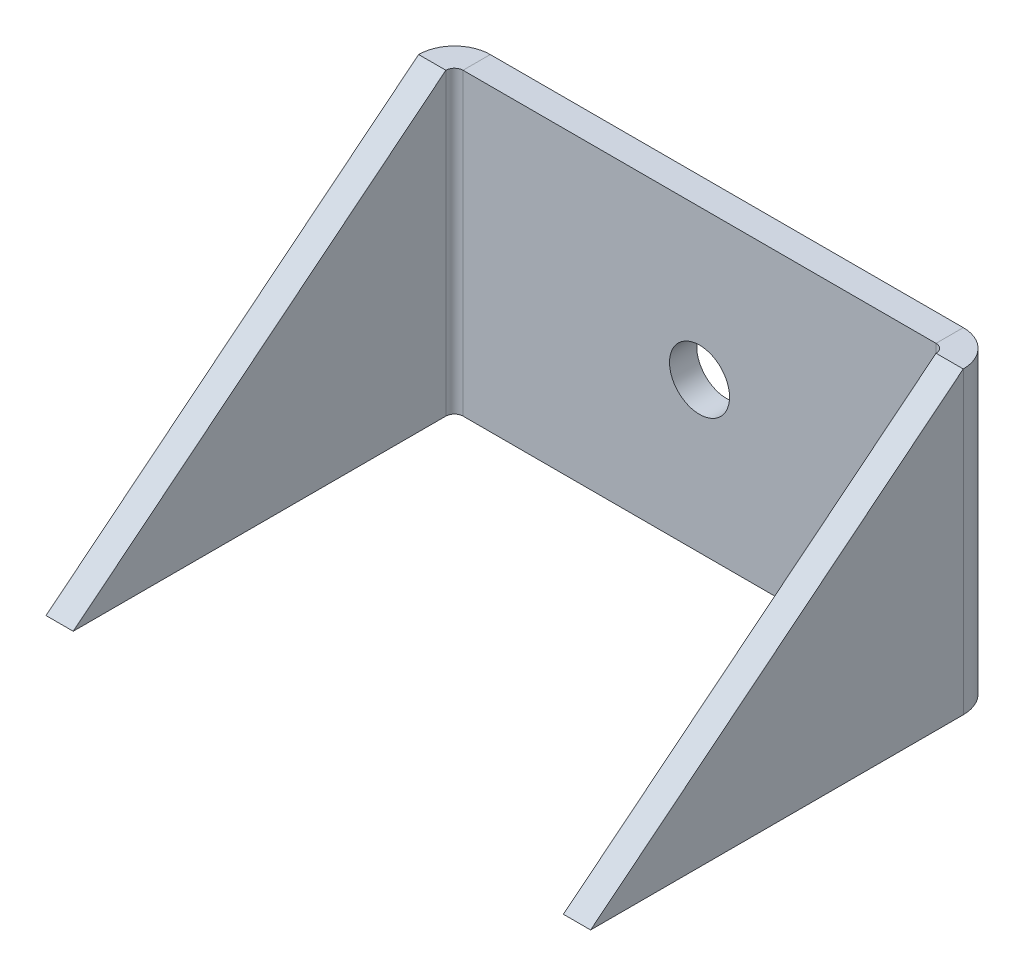
ISO-10303-21;
HEADER;
FILE_DESCRIPTION(('STEP AP214'),'2;1');
FILE_NAME('part.step','',(''),(''),'','','');
FILE_SCHEMA(('AUTOMOTIVE_DESIGN { 1 0 10303 214 1 1 1 1 }'));
ENDSEC;
DATA;
#1=APPLICATION_CONTEXT('core data for automotive mechanical design processes');
#2=APPLICATION_PROTOCOL_DEFINITION('international standard','automotive_design',2000,#1);
#3=PRODUCT_CONTEXT('',#1,'mechanical');
#4=PRODUCT('Part','Part','',(#3));
#5=PRODUCT_RELATED_PRODUCT_CATEGORY('part','',(#4));
#6=PRODUCT_DEFINITION_FORMATION('','',#4);
#7=PRODUCT_DEFINITION_CONTEXT('part definition',#1,'design');
#8=PRODUCT_DEFINITION('design','',#6,#7);
#9=PRODUCT_DEFINITION_SHAPE('','',#8);
#10=(LENGTH_UNIT() NAMED_UNIT(*) SI_UNIT(.MILLI.,.METRE.));
#11=(NAMED_UNIT(*) PLANE_ANGLE_UNIT() SI_UNIT($,.RADIAN.));
#12=(NAMED_UNIT(*) SI_UNIT($,.STERADIAN.) SOLID_ANGLE_UNIT());
#13=UNCERTAINTY_MEASURE_WITH_UNIT(LENGTH_MEASURE(1.E-05),#10,'distance_accuracy_value','');
#14=(GEOMETRIC_REPRESENTATION_CONTEXT(3) GLOBAL_UNCERTAINTY_ASSIGNED_CONTEXT((#13)) GLOBAL_UNIT_ASSIGNED_CONTEXT((#10,
#11,#12)) REPRESENTATION_CONTEXT('',''));
#15=CARTESIAN_POINT('',(0.,0.,0.));
#16=DIRECTION('',(0.,0.,1.));
#17=DIRECTION('',(1.,0.,0.));
#18=AXIS2_PLACEMENT_3D('',#15,#16,#17);
#19=CARTESIAN_POINT('',(-31.75,0.,-1.11451597218056E-13));
#20=DIRECTION('',(1.,0.,0.));
#21=DIRECTION('',(0.,0.,1.));
#22=AXIS2_PLACEMENT_3D('',#19,#20,#21);
#23=PLANE('',#22);
#24=DIRECTION('',(0.,0.626498155753381,-0.77942290243334));
#25=VECTOR('',#24,1.);
#26=CARTESIAN_POINT('',(-31.75,17.4625,4.17499999999998));
#27=LINE('',#26,#25);
#28=CARTESIAN_POINT('',(-31.7500000000002,-17.4625,47.625));
#29=VERTEX_POINT('',#28);
#30=CARTESIAN_POINT('',(-31.75,17.4625,4.17499999999998));
#31=VERTEX_POINT('',#30);
#32=EDGE_CURVE('E132',#29,#31,#27,.T.);
#33=ORIENTED_EDGE('',*,*,#32,.T.);
#34=DIRECTION('',(0.,1.,0.));
#35=VECTOR('',#34,1.);
#36=CARTESIAN_POINT('',(-31.75,0.,4.17499999999998));
#37=LINE('',#36,#35);
#38=CARTESIAN_POINT('',(-31.75,-17.4625,4.17499999999999));
#39=VERTEX_POINT('',#38);
#40=EDGE_CURVE('E155',#39,#31,#37,.T.);
#41=ORIENTED_EDGE('',*,*,#40,.F.);
#42=DIRECTION('',(0.,0.,-1.));
#43=VECTOR('',#42,1.);
#44=CARTESIAN_POINT('',(-31.75,-17.4625,3.17499999999999));
#45=LINE('',#44,#43);
#46=EDGE_CURVE('E161',#29,#39,#45,.T.);
#47=ORIENTED_EDGE('',*,*,#46,.F.);
#48=EDGE_LOOP('',(#33,#41,#47));
#49=FACE_BOUND('',#48,.T.);
#50=ADVANCED_FACE('F42',(#49),#23,.F.);
#51=CARTESIAN_POINT('',(-28.575,0.,-1.00366143967229E-13));
#52=DIRECTION('',(1.,0.,0.));
#53=DIRECTION('',(0.,0.,1.));
#54=AXIS2_PLACEMENT_3D('',#51,#52,#53);
#55=PLANE('',#54);
#56=DIRECTION('',(0.,-1.,0.));
#57=VECTOR('',#56,1.);
#58=CARTESIAN_POINT('',(-28.575,17.4625,4.17499999999999));
#59=LINE('',#58,#57);
#60=CARTESIAN_POINT('',(-28.575,17.4625,4.17499999999999));
#61=VERTEX_POINT('',#60);
#62=CARTESIAN_POINT('',(-28.575,-17.4625,4.175));
#63=VERTEX_POINT('',#62);
#64=EDGE_CURVE('E142',#61,#63,#59,.T.);
#65=ORIENTED_EDGE('',*,*,#64,.F.);
#66=DIRECTION('',(0.,0.626498155753381,-0.77942290243334));
#67=VECTOR('',#66,1.);
#68=CARTESIAN_POINT('',(-28.575,17.4625,4.17499999999999));
#69=LINE('',#68,#67);
#70=CARTESIAN_POINT('',(-28.5750000000001,-17.4625,47.625));
#71=VERTEX_POINT('',#70);
#72=EDGE_CURVE('E121',#71,#61,#69,.T.);
#73=ORIENTED_EDGE('',*,*,#72,.F.);
#74=DIRECTION('',(0.,0.,-1.));
#75=VECTOR('',#74,1.);
#76=CARTESIAN_POINT('',(-28.575,-17.4625,3.175));
#77=LINE('',#76,#75);
#78=EDGE_CURVE('E151',#71,#63,#77,.T.);
#79=ORIENTED_EDGE('',*,*,#78,.T.);
#80=EDGE_LOOP('',(#65,#73,#79));
#81=FACE_BOUND('',#80,.T.);
#82=ADVANCED_FACE('F150',(#81),#55,.T.);
#83=CARTESIAN_POINT('',(-28.575,17.4625,3.175));
#84=DIRECTION('',(0.,-1.,0.));
#85=DIRECTION('',(0.,0.,-1.));
#86=AXIS2_PLACEMENT_3D('',#83,#84,#85);
#87=PLANE('',#86);
#88=DIRECTION('',(0.,0.,-1.));
#89=VECTOR('',#88,1.);
#90=CARTESIAN_POINT('',(-27.575,17.4625,3.175));
#91=LINE('',#90,#89);
#92=CARTESIAN_POINT('',(-27.575,17.4625,3.175));
#93=VERTEX_POINT('',#92);
#94=CARTESIAN_POINT('',(-27.575,17.4625,0.));
#95=VERTEX_POINT('',#94);
#96=EDGE_CURVE('E59',#93,#95,#91,.T.);
#97=ORIENTED_EDGE('',*,*,#96,.F.);
#98=DIRECTION('',(-1.,0.,0.));
#99=VECTOR('',#98,1.);
#100=CARTESIAN_POINT('',(-28.575,17.4625,3.175));
#101=LINE('',#100,#99);
#102=CARTESIAN_POINT('',(27.575,17.4625,3.175));
#103=VERTEX_POINT('',#102);
#104=EDGE_CURVE('E51',#103,#93,#101,.T.);
#105=ORIENTED_EDGE('',*,*,#104,.F.);
#106=DIRECTION('',(0.,0.,-1.));
#107=VECTOR('',#106,1.);
#108=CARTESIAN_POINT('',(27.575,17.4625,3.17499999999999));
#109=LINE('',#108,#107);
#110=CARTESIAN_POINT('',(27.575,17.4625,0.));
#111=VERTEX_POINT('',#110);
#112=EDGE_CURVE('E210',#103,#111,#109,.T.);
#113=ORIENTED_EDGE('',*,*,#112,.T.);
#114=DIRECTION('',(-1.,0.,0.));
#115=VECTOR('',#114,1.);
#116=CARTESIAN_POINT('',(-28.575,17.4625,0.));
#117=LINE('',#116,#115);
#118=EDGE_CURVE('E224',#111,#95,#117,.T.);
#119=ORIENTED_EDGE('',*,*,#118,.T.);
#120=EDGE_LOOP('',(#97,#105,#113,#119));
#121=FACE_BOUND('',#120,.T.);
#122=ADVANCED_FACE('F44',(#121),#87,.F.);
#123=CARTESIAN_POINT('',(-28.575,-17.4625,3.175));
#124=DIRECTION('',(0.,1.,0.));
#125=DIRECTION('',(0.,0.,1.));
#126=AXIS2_PLACEMENT_3D('',#123,#124,#125);
#127=PLANE('',#126);
#128=DIRECTION('',(0.,0.,-1.));
#129=VECTOR('',#128,1.);
#130=CARTESIAN_POINT('',(-27.575,-17.4625,3.175));
#131=LINE('',#130,#129);
#132=CARTESIAN_POINT('',(-27.575,-17.4625,3.175));
#133=VERTEX_POINT('',#132);
#134=CARTESIAN_POINT('',(-27.575,-17.4625,0.));
#135=VERTEX_POINT('',#134);
#136=EDGE_CURVE('E170',#133,#135,#131,.T.);
#137=ORIENTED_EDGE('',*,*,#136,.T.);
#138=DIRECTION('',(1.,0.,0.));
#139=VECTOR('',#138,1.);
#140=CARTESIAN_POINT('',(-28.575,-17.4625,0.));
#141=LINE('',#140,#139);
#142=CARTESIAN_POINT('',(27.575,-17.4625,0.));
#143=VERTEX_POINT('',#142);
#144=EDGE_CURVE('E46',#135,#143,#141,.T.);
#145=ORIENTED_EDGE('',*,*,#144,.T.);
#146=DIRECTION('',(0.,0.,-1.));
#147=VECTOR('',#146,1.);
#148=CARTESIAN_POINT('',(27.575,-17.4625,3.17499999999999));
#149=LINE('',#148,#147);
#150=CARTESIAN_POINT('',(27.575,-17.4625,3.175));
#151=VERTEX_POINT('',#150);
#152=EDGE_CURVE('E221',#151,#143,#149,.T.);
#153=ORIENTED_EDGE('',*,*,#152,.F.);
#154=DIRECTION('',(1.,0.,0.));
#155=VECTOR('',#154,1.);
#156=CARTESIAN_POINT('',(-28.575,-17.4625,3.175));
#157=LINE('',#156,#155);
#158=EDGE_CURVE('E11',#133,#151,#157,.T.);
#159=ORIENTED_EDGE('',*,*,#158,.F.);
#160=EDGE_LOOP('',(#137,#145,#153,#159));
#161=FACE_BOUND('',#160,.T.);
#162=ADVANCED_FACE('F230',(#161),#127,.F.);
#163=CARTESIAN_POINT('',(0.,0.,3.175));
#164=DIRECTION('',(0.,0.,1.));
#165=DIRECTION('',(1.,0.,0.));
#166=AXIS2_PLACEMENT_3D('',#163,#164,#165);
#167=PLANE('',#166);
#168=CARTESIAN_POINT('',(0.,0.,3.175));
#169=DIRECTION('',(0.,0.,1.));
#170=DIRECTION('',(1.,0.,0.));
#171=AXIS2_PLACEMENT_3D('',#168,#169,#170);
#172=CIRCLE('',#171,3.5);
#173=CARTESIAN_POINT('',(3.5,0.,3.175));
#174=VERTEX_POINT('',#173);
#175=EDGE_CURVE('E300',#174,#174,#172,.T.);
#176=ORIENTED_EDGE('',*,*,#175,.F.);
#177=EDGE_LOOP('',(#176));
#178=FACE_BOUND('',#177,.T.);
#179=ORIENTED_EDGE('',*,*,#104,.T.);
#180=DIRECTION('',(0.,-1.,0.));
#181=VECTOR('',#180,1.);
#182=CARTESIAN_POINT('',(-27.575,-17.4625,3.175));
#183=LINE('',#182,#181);
#184=EDGE_CURVE('E65',#133,#93,#183,.F.);
#185=ORIENTED_EDGE('',*,*,#184,.F.);
#186=ORIENTED_EDGE('',*,*,#158,.T.);
#187=DIRECTION('',(0.,1.,0.));
#188=VECTOR('',#187,1.);
#189=CARTESIAN_POINT('',(27.575,17.4625,3.17499999999999));
#190=LINE('',#189,#188);
#191=EDGE_CURVE('E216',#103,#151,#190,.F.);
#192=ORIENTED_EDGE('',*,*,#191,.F.);
#193=EDGE_LOOP('',(#179,#185,#186,#192));
#194=FACE_BOUND('',#193,.T.);
#195=ADVANCED_FACE('F262',(#178,#194),#167,.T.);
#196=CARTESIAN_POINT('',(0.,0.,0.));
#197=DIRECTION('',(0.,0.,1.));
#198=DIRECTION('',(1.,0.,0.));
#199=AXIS2_PLACEMENT_3D('',#196,#197,#198);
#200=PLANE('',#199);
#201=CARTESIAN_POINT('',(0.,0.,0.));
#202=DIRECTION('',(0.,0.,1.));
#203=DIRECTION('',(1.,0.,0.));
#204=AXIS2_PLACEMENT_3D('',#201,#202,#203);
#205=CIRCLE('',#204,3.5);
#206=CARTESIAN_POINT('',(3.5,0.,0.));
#207=VERTEX_POINT('',#206);
#208=EDGE_CURVE('E297',#207,#207,#205,.T.);
#209=ORIENTED_EDGE('',*,*,#208,.T.);
#210=EDGE_LOOP('',(#209));
#211=FACE_BOUND('',#210,.T.);
#212=DIRECTION('',(0.,-1.,0.));
#213=VECTOR('',#212,1.);
#214=CARTESIAN_POINT('',(-27.575,-17.4625,0.));
#215=LINE('',#214,#213);
#216=EDGE_CURVE('E167',#135,#95,#215,.F.);
#217=ORIENTED_EDGE('',*,*,#216,.T.);
#218=ORIENTED_EDGE('',*,*,#118,.F.);
#219=DIRECTION('',(0.,1.,0.));
#220=VECTOR('',#219,1.);
#221=CARTESIAN_POINT('',(27.575,17.4625,0.));
#222=LINE('',#221,#220);
#223=EDGE_CURVE('E203',#111,#143,#222,.F.);
#224=ORIENTED_EDGE('',*,*,#223,.T.);
#225=ORIENTED_EDGE('',*,*,#144,.F.);
#226=EDGE_LOOP('',(#217,#218,#224,#225));
#227=FACE_BOUND('',#226,.T.);
#228=ADVANCED_FACE('F235',(#211,#227),#200,.F.);
#229=CARTESIAN_POINT('',(27.575,-17.4625,4.175));
#230=DIRECTION('',(0.,-1.,0.));
#231=DIRECTION('',(0.,0.,-1.));
#232=AXIS2_PLACEMENT_3D('',#229,#230,#231);
#233=PLANE('',#232);
#234=DIRECTION('',(1.,0.,0.));
#235=VECTOR('',#234,1.);
#236=CARTESIAN_POINT('',(28.575,-17.4625,4.17499999999999));
#237=LINE('',#236,#235);
#238=CARTESIAN_POINT('',(28.575,-17.4625,4.17499999999999));
#239=VERTEX_POINT('',#238);
#240=CARTESIAN_POINT('',(31.75,-17.4625,4.17499999999998));
#241=VERTEX_POINT('',#240);
#242=EDGE_CURVE('E181',#239,#241,#237,.T.);
#243=ORIENTED_EDGE('',*,*,#242,.F.);
#244=CARTESIAN_POINT('',(27.575,-17.4625,4.175));
#245=DIRECTION('',(0.,1.,0.));
#246=DIRECTION('',(0.,0.,1.));
#247=AXIS2_PLACEMENT_3D('',#244,#245,#246);
#248=CIRCLE('',#247,1.);
#249=EDGE_CURVE('E213',#151,#239,#248,.F.);
#250=ORIENTED_EDGE('',*,*,#249,.F.);
#251=ORIENTED_EDGE('',*,*,#152,.T.);
#252=CARTESIAN_POINT('',(27.575,-17.4625,4.175));
#253=DIRECTION('',(0.,1.,0.));
#254=DIRECTION('',(0.,0.,1.));
#255=AXIS2_PLACEMENT_3D('',#252,#253,#254);
#256=CIRCLE('',#255,4.175);
#257=EDGE_CURVE('E206',#143,#241,#256,.F.);
#258=ORIENTED_EDGE('',*,*,#257,.T.);
#259=EDGE_LOOP('',(#243,#250,#251,#258));
#260=FACE_BOUND('',#259,.T.);
#261=ADVANCED_FACE('F241',(#260),#233,.T.);
#262=CARTESIAN_POINT('',(27.575,17.4625,4.175));
#263=DIRECTION('',(0.,-1.,0.));
#264=DIRECTION('',(0.,0.,-1.));
#265=AXIS2_PLACEMENT_3D('',#262,#263,#264);
#266=PLANE('',#265);
#267=CARTESIAN_POINT('',(27.575,17.4625,4.175));
#268=DIRECTION('',(0.,1.,0.));
#269=DIRECTION('',(0.,0.,1.));
#270=AXIS2_PLACEMENT_3D('',#267,#268,#269);
#271=CIRCLE('',#270,1.);
#272=CARTESIAN_POINT('',(28.575,17.4625,4.17499999999999));
#273=VERTEX_POINT('',#272);
#274=EDGE_CURVE('E202',#273,#103,#271,.T.);
#275=ORIENTED_EDGE('',*,*,#274,.F.);
#276=DIRECTION('',(1.,0.,0.));
#277=VECTOR('',#276,1.);
#278=CARTESIAN_POINT('',(28.575,17.4625,4.17499999999999));
#279=LINE('',#278,#277);
#280=CARTESIAN_POINT('',(31.75,17.4625,4.17499999999998));
#281=VERTEX_POINT('',#280);
#282=EDGE_CURVE('E186',#273,#281,#279,.T.);
#283=ORIENTED_EDGE('',*,*,#282,.T.);
#284=CARTESIAN_POINT('',(27.575,17.4625,4.175));
#285=DIRECTION('',(0.,1.,0.));
#286=DIRECTION('',(0.,0.,1.));
#287=AXIS2_PLACEMENT_3D('',#284,#285,#286);
#288=CIRCLE('',#287,4.175);
#289=EDGE_CURVE('E207',#281,#111,#288,.T.);
#290=ORIENTED_EDGE('',*,*,#289,.T.);
#291=ORIENTED_EDGE('',*,*,#112,.F.);
#292=EDGE_LOOP('',(#275,#283,#290,#291));
#293=FACE_BOUND('',#292,.T.);
#294=ADVANCED_FACE('F260',(#293),#266,.F.);
#295=CARTESIAN_POINT('',(27.575,17.4625,4.175));
#296=DIRECTION('',(0.,1.,0.));
#297=DIRECTION('',(1.,0.,0.));
#298=AXIS2_PLACEMENT_3D('',#295,#296,#297);
#299=CYLINDRICAL_SURFACE('',#298,4.175);
#300=ORIENTED_EDGE('',*,*,#223,.F.);
#301=ORIENTED_EDGE('',*,*,#289,.F.);
#302=DIRECTION('',(0.,-1.,0.));
#303=VECTOR('',#302,1.);
#304=CARTESIAN_POINT('',(31.75,0.,4.17499999999998));
#305=LINE('',#304,#303);
#306=EDGE_CURVE('E189',#281,#241,#305,.T.);
#307=ORIENTED_EDGE('',*,*,#306,.T.);
#308=ORIENTED_EDGE('',*,*,#257,.F.);
#309=EDGE_LOOP('',(#300,#301,#307,#308));
#310=FACE_BOUND('',#309,.T.);
#311=ADVANCED_FACE('F242',(#310),#299,.T.);
#312=CARTESIAN_POINT('',(27.575,17.4625,4.175));
#313=DIRECTION('',(0.,1.,0.));
#314=DIRECTION('',(1.,0.,0.));
#315=AXIS2_PLACEMENT_3D('',#312,#313,#314);
#316=CYLINDRICAL_SURFACE('',#315,1.);
#317=ORIENTED_EDGE('',*,*,#191,.T.);
#318=ORIENTED_EDGE('',*,*,#249,.T.);
#319=DIRECTION('',(0.,1.,0.));
#320=VECTOR('',#319,1.);
#321=CARTESIAN_POINT('',(28.575,-17.4625,4.17499999999999));
#322=LINE('',#321,#320);
#323=EDGE_CURVE('E183',#239,#273,#322,.T.);
#324=ORIENTED_EDGE('',*,*,#323,.T.);
#325=ORIENTED_EDGE('',*,*,#274,.T.);
#326=EDGE_LOOP('',(#317,#318,#324,#325));
#327=FACE_BOUND('',#326,.T.);
#328=ADVANCED_FACE('F253',(#327),#316,.F.);
#329=CARTESIAN_POINT('',(31.75,-17.4625,3.17499999999999));
#330=DIRECTION('',(0.,1.,0.));
#331=DIRECTION('',(-1.,0.,0.));
#332=AXIS2_PLACEMENT_3D('',#329,#330,#331);
#333=PLANE('',#332);
#334=ORIENTED_EDGE('',*,*,#242,.T.);
#335=DIRECTION('',(0.,0.,-1.));
#336=VECTOR('',#335,1.);
#337=CARTESIAN_POINT('',(31.75,-17.4625,3.17499999999999));
#338=LINE('',#337,#336);
#339=CARTESIAN_POINT('',(31.7500000000001,-17.4625,47.625));
#340=VERTEX_POINT('',#339);
#341=EDGE_CURVE('E194',#340,#241,#338,.T.);
#342=ORIENTED_EDGE('',*,*,#341,.F.);
#343=DIRECTION('',(-1.,0.,0.));
#344=VECTOR('',#343,1.);
#345=CARTESIAN_POINT('',(31.7500000000002,-17.4625,47.625));
#346=LINE('',#345,#344);
#347=CARTESIAN_POINT('',(28.5750000000002,-17.4625,47.625));
#348=VERTEX_POINT('',#347);
#349=EDGE_CURVE('E197',#340,#348,#346,.T.);
#350=ORIENTED_EDGE('',*,*,#349,.T.);
#351=DIRECTION('',(0.,0.,-1.));
#352=VECTOR('',#351,1.);
#353=CARTESIAN_POINT('',(28.575,-17.4625,3.175));
#354=LINE('',#353,#352);
#355=EDGE_CURVE('E193',#348,#239,#354,.T.);
#356=ORIENTED_EDGE('',*,*,#355,.T.);
#357=EDGE_LOOP('',(#334,#342,#350,#356));
#358=FACE_BOUND('',#357,.T.);
#359=ADVANCED_FACE('F249',(#358),#333,.F.);
#360=CARTESIAN_POINT('',(31.75,0.,-1.11451597218056E-13));
#361=DIRECTION('',(-1.,0.,0.));
#362=DIRECTION('',(0.,0.,1.));
#363=AXIS2_PLACEMENT_3D('',#360,#361,#362);
#364=PLANE('',#363);
#365=ORIENTED_EDGE('',*,*,#306,.F.);
#366=DIRECTION('',(0.,0.626498155753381,-0.77942290243334));
#367=VECTOR('',#366,1.);
#368=CARTESIAN_POINT('',(31.75,17.4625,4.17499999999998));
#369=LINE('',#368,#367);
#370=EDGE_CURVE('E176',#340,#281,#369,.T.);
#371=ORIENTED_EDGE('',*,*,#370,.F.);
#372=ORIENTED_EDGE('',*,*,#341,.T.);
#373=EDGE_LOOP('',(#365,#371,#372));
#374=FACE_BOUND('',#373,.T.);
#375=ADVANCED_FACE('F246',(#374),#364,.F.);
#376=CARTESIAN_POINT('',(28.575,0.,-1.00366143967229E-13));
#377=DIRECTION('',(-1.,0.,0.));
#378=DIRECTION('',(0.,0.,1.));
#379=AXIS2_PLACEMENT_3D('',#376,#377,#378);
#380=PLANE('',#379);
#381=DIRECTION('',(0.,0.626498155753381,-0.77942290243334));
#382=VECTOR('',#381,1.);
#383=CARTESIAN_POINT('',(28.575,17.4625,4.17499999999999));
#384=LINE('',#383,#382);
#385=EDGE_CURVE('E178',#348,#273,#384,.T.);
#386=ORIENTED_EDGE('',*,*,#385,.T.);
#387=ORIENTED_EDGE('',*,*,#323,.F.);
#388=ORIENTED_EDGE('',*,*,#355,.F.);
#389=EDGE_LOOP('',(#386,#387,#388));
#390=FACE_BOUND('',#389,.T.);
#391=ADVANCED_FACE('F256',(#390),#380,.T.);
#392=CARTESIAN_POINT('',(28.575,17.4625,4.17499999999999));
#393=DIRECTION('',(0.,-0.77942290243334,-0.626498155753381));
#394=DIRECTION('',(0.,0.626498155753381,-0.779422902433341));
#395=AXIS2_PLACEMENT_3D('',#392,#393,#394);
#396=PLANE('',#395);
#397=ORIENTED_EDGE('',*,*,#370,.T.);
#398=ORIENTED_EDGE('',*,*,#282,.F.);
#399=ORIENTED_EDGE('',*,*,#385,.F.);
#400=ORIENTED_EDGE('',*,*,#349,.F.);
#401=EDGE_LOOP('',(#397,#398,#399,#400));
#402=FACE_BOUND('',#401,.T.);
#403=ADVANCED_FACE('F258',(#402),#396,.F.);
#404=CARTESIAN_POINT('',(-27.575,17.4625,4.175));
#405=DIRECTION('',(0.,1.,0.));
#406=DIRECTION('',(0.,0.,1.));
#407=AXIS2_PLACEMENT_3D('',#404,#405,#406);
#408=PLANE('',#407);
#409=DIRECTION('',(-1.,0.,0.));
#410=VECTOR('',#409,1.);
#411=CARTESIAN_POINT('',(-28.575,17.4625,4.17499999999999));
#412=LINE('',#411,#410);
#413=EDGE_CURVE('E124',#61,#31,#412,.T.);
#414=ORIENTED_EDGE('',*,*,#413,.F.);
#415=CARTESIAN_POINT('',(-27.575,17.4625,4.175));
#416=DIRECTION('',(0.,-1.,0.));
#417=DIRECTION('',(0.,0.,-1.));
#418=AXIS2_PLACEMENT_3D('',#415,#416,#417);
#419=CIRCLE('',#418,0.999999999999997);
#420=EDGE_CURVE('E139',#93,#61,#419,.F.);
#421=ORIENTED_EDGE('',*,*,#420,.F.);
#422=ORIENTED_EDGE('',*,*,#96,.T.);
#423=CARTESIAN_POINT('',(-27.575,17.4625,4.175));
#424=DIRECTION('',(0.,-1.,0.));
#425=DIRECTION('',(0.,0.,-1.));
#426=AXIS2_PLACEMENT_3D('',#423,#424,#425);
#427=CIRCLE('',#426,4.175);
#428=EDGE_CURVE('E141',#95,#31,#427,.F.);
#429=ORIENTED_EDGE('',*,*,#428,.T.);
#430=EDGE_LOOP('',(#414,#421,#422,#429));
#431=FACE_BOUND('',#430,.T.);
#432=ADVANCED_FACE('F138',(#431),#408,.T.);
#433=CARTESIAN_POINT('',(-27.575,-17.4625,4.175));
#434=DIRECTION('',(0.,1.,0.));
#435=DIRECTION('',(0.,0.,1.));
#436=AXIS2_PLACEMENT_3D('',#433,#434,#435);
#437=PLANE('',#436);
#438=CARTESIAN_POINT('',(-27.575,-17.4625,4.175));
#439=DIRECTION('',(0.,-1.,0.));
#440=DIRECTION('',(0.,0.,-1.));
#441=AXIS2_PLACEMENT_3D('',#438,#439,#440);
#442=CIRCLE('',#441,0.999999999999997);
#443=EDGE_CURVE('E166',#63,#133,#442,.T.);
#444=ORIENTED_EDGE('',*,*,#443,.F.);
#445=DIRECTION('',(-1.,0.,0.));
#446=VECTOR('',#445,1.);
#447=CARTESIAN_POINT('',(-28.575,-17.4625,4.175));
#448=LINE('',#447,#446);
#449=EDGE_CURVE('E152',#63,#39,#448,.T.);
#450=ORIENTED_EDGE('',*,*,#449,.T.);
#451=CARTESIAN_POINT('',(-27.575,-17.4625,4.175));
#452=DIRECTION('',(0.,-1.,0.));
#453=DIRECTION('',(0.,0.,-1.));
#454=AXIS2_PLACEMENT_3D('',#451,#452,#453);
#455=CIRCLE('',#454,4.175);
#456=EDGE_CURVE('E148',#39,#135,#455,.T.);
#457=ORIENTED_EDGE('',*,*,#456,.T.);
#458=ORIENTED_EDGE('',*,*,#136,.F.);
#459=EDGE_LOOP('',(#444,#450,#457,#458));
#460=FACE_BOUND('',#459,.T.);
#461=ADVANCED_FACE('F264',(#460),#437,.F.);
#462=CARTESIAN_POINT('',(-27.575,-17.4625,4.175));
#463=DIRECTION('',(0.,-1.,0.));
#464=DIRECTION('',(-1.,0.,0.));
#465=AXIS2_PLACEMENT_3D('',#462,#463,#464);
#466=CYLINDRICAL_SURFACE('',#465,4.175);
#467=ORIENTED_EDGE('',*,*,#216,.F.);
#468=ORIENTED_EDGE('',*,*,#456,.F.);
#469=ORIENTED_EDGE('',*,*,#40,.T.);
#470=ORIENTED_EDGE('',*,*,#428,.F.);
#471=EDGE_LOOP('',(#467,#468,#469,#470));
#472=FACE_BOUND('',#471,.T.);
#473=ADVANCED_FACE('F268',(#472),#466,.T.);
#474=CARTESIAN_POINT('',(-27.575,-17.4625,4.175));
#475=DIRECTION('',(0.,-1.,0.));
#476=DIRECTION('',(-1.,0.,0.));
#477=AXIS2_PLACEMENT_3D('',#474,#475,#476);
#478=CYLINDRICAL_SURFACE('',#477,0.999999999999997);
#479=ORIENTED_EDGE('',*,*,#184,.T.);
#480=ORIENTED_EDGE('',*,*,#420,.T.);
#481=ORIENTED_EDGE('',*,*,#64,.T.);
#482=ORIENTED_EDGE('',*,*,#443,.T.);
#483=EDGE_LOOP('',(#479,#480,#481,#482));
#484=FACE_BOUND('',#483,.T.);
#485=ADVANCED_FACE('F145',(#484),#478,.F.);
#486=CARTESIAN_POINT('',(-31.75,-17.4625,3.17499999999999));
#487=DIRECTION('',(0.,-1.,0.));
#488=DIRECTION('',(1.,0.,0.));
#489=AXIS2_PLACEMENT_3D('',#486,#487,#488);
#490=PLANE('',#489);
#491=ORIENTED_EDGE('',*,*,#46,.T.);
#492=ORIENTED_EDGE('',*,*,#449,.F.);
#493=ORIENTED_EDGE('',*,*,#78,.F.);
#494=DIRECTION('',(1.,0.,0.));
#495=VECTOR('',#494,1.);
#496=CARTESIAN_POINT('',(-31.7500000000002,-17.4625,47.625));
#497=LINE('',#496,#495);
#498=EDGE_CURVE('E127',#29,#71,#497,.T.);
#499=ORIENTED_EDGE('',*,*,#498,.F.);
#500=EDGE_LOOP('',(#491,#492,#493,#499));
#501=FACE_BOUND('',#500,.T.);
#502=ADVANCED_FACE('F272',(#501),#490,.T.);
#503=CARTESIAN_POINT('',(-28.575,17.4625,4.17499999999999));
#504=DIRECTION('',(0.,0.77942290243334,0.626498155753381));
#505=DIRECTION('',(0.,-0.626498155753381,0.779422902433341));
#506=AXIS2_PLACEMENT_3D('',#503,#504,#505);
#507=PLANE('',#506);
#508=ORIENTED_EDGE('',*,*,#32,.F.);
#509=ORIENTED_EDGE('',*,*,#498,.T.);
#510=ORIENTED_EDGE('',*,*,#72,.T.);
#511=ORIENTED_EDGE('',*,*,#413,.T.);
#512=EDGE_LOOP('',(#508,#509,#510,#511));
#513=FACE_BOUND('',#512,.T.);
#514=ADVANCED_FACE('F123',(#513),#507,.T.);
#515=CARTESIAN_POINT('',(0.,0.,3.175));
#516=DIRECTION('',(0.,0.,1.));
#517=DIRECTION('',(1.,0.,0.));
#518=AXIS2_PLACEMENT_3D('',#515,#516,#517);
#519=CYLINDRICAL_SURFACE('',#518,3.5);
#520=ORIENTED_EDGE('',*,*,#208,.F.);
#521=EDGE_LOOP('',(#520));
#522=FACE_BOUND('',#521,.T.);
#523=ORIENTED_EDGE('',*,*,#175,.T.);
#524=EDGE_LOOP('',(#523));
#525=FACE_BOUND('',#524,.T.);
#526=ADVANCED_FACE('F279',(#522,#525),#519,.F.);
#527=CLOSED_SHELL('',(#50,#82,#122,#162,#195,#228,#261,#294,#311,#328,#359,#375,#391,#403,#432,
#461,#473,#485,#502,#514,#526));
#528=MANIFOLD_SOLID_BREP('B2',#527);
#529=ADVANCED_BREP_SHAPE_REPRESENTATION('',(#18,#528),#14);
#530=SHAPE_DEFINITION_REPRESENTATION(#9,#529);
ENDSEC;
END-ISO-10303-21;
